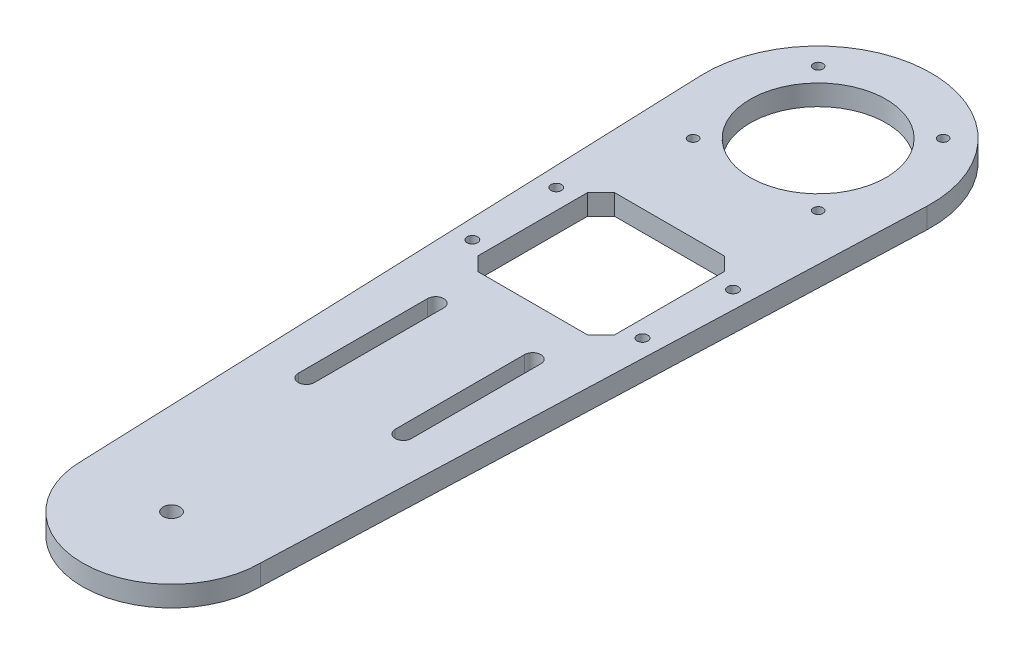
ISO-10303-21;
HEADER;
FILE_DESCRIPTION(('STEP AP214'),'2;1');
FILE_NAME('part.step','',(''),(''),'','','');
FILE_SCHEMA(('AUTOMOTIVE_DESIGN { 1 0 10303 214 1 1 1 1 }'));
ENDSEC;
DATA;
#1=APPLICATION_CONTEXT('core data for automotive mechanical design processes');
#2=APPLICATION_PROTOCOL_DEFINITION('international standard','automotive_design',2000,#1);
#3=PRODUCT_CONTEXT('',#1,'mechanical');
#4=PRODUCT('Part','Part','',(#3));
#5=PRODUCT_RELATED_PRODUCT_CATEGORY('part','',(#4));
#6=PRODUCT_DEFINITION_FORMATION('','',#4);
#7=PRODUCT_DEFINITION_CONTEXT('part definition',#1,'design');
#8=PRODUCT_DEFINITION('design','',#6,#7);
#9=PRODUCT_DEFINITION_SHAPE('','',#8);
#10=(LENGTH_UNIT() NAMED_UNIT(*) SI_UNIT(.MILLI.,.METRE.));
#11=(NAMED_UNIT(*) PLANE_ANGLE_UNIT() SI_UNIT($,.RADIAN.));
#12=(NAMED_UNIT(*) SI_UNIT($,.STERADIAN.) SOLID_ANGLE_UNIT());
#13=UNCERTAINTY_MEASURE_WITH_UNIT(LENGTH_MEASURE(1.E-05),#10,'distance_accuracy_value','');
#14=(GEOMETRIC_REPRESENTATION_CONTEXT(3) GLOBAL_UNCERTAINTY_ASSIGNED_CONTEXT((#13)) GLOBAL_UNIT_ASSIGNED_CONTEXT((#10,
#11,#12)) REPRESENTATION_CONTEXT('',''));
#15=CARTESIAN_POINT('',(0.,0.,0.));
#16=DIRECTION('',(0.,0.,1.));
#17=DIRECTION('',(1.,0.,0.));
#18=AXIS2_PLACEMENT_3D('',#15,#16,#17);
#19=CARTESIAN_POINT('',(0.,6.35,0.));
#20=DIRECTION('',(0.,1.,0.));
#21=DIRECTION('',(0.,0.,1.));
#22=AXIS2_PLACEMENT_3D('',#19,#20,#21);
#23=PLANE('',#22);
#24=CARTESIAN_POINT('',(-15.,6.35,-96.7));
#25=DIRECTION('',(0.,1.,0.));
#26=DIRECTION('',(0.,0.,1.));
#27=AXIS2_PLACEMENT_3D('',#24,#25,#26);
#28=CIRCLE('',#27,2.5);
#29=CARTESIAN_POINT('',(-12.5,6.35,-96.7));
#30=VERTEX_POINT('',#29);
#31=CARTESIAN_POINT('',(-17.5,6.35,-96.7));
#32=VERTEX_POINT('',#31);
#33=EDGE_CURVE('E207',#30,#32,#28,.T.);
#34=ORIENTED_EDGE('',*,*,#33,.F.);
#35=DIRECTION('',(0.,0.,-1.));
#36=VECTOR('',#35,1.);
#37=CARTESIAN_POINT('',(-12.5,6.35,-96.7));
#38=LINE('',#37,#36);
#39=CARTESIAN_POINT('',(-12.5,6.35,-56.7));
#40=VERTEX_POINT('',#39);
#41=EDGE_CURVE('E215',#40,#30,#38,.T.);
#42=ORIENTED_EDGE('',*,*,#41,.F.);
#43=CARTESIAN_POINT('',(-15.,6.35,-56.7));
#44=DIRECTION('',(0.,1.,0.));
#45=DIRECTION('',(0.,0.,1.));
#46=AXIS2_PLACEMENT_3D('',#43,#44,#45);
#47=CIRCLE('',#46,2.5);
#48=CARTESIAN_POINT('',(-17.5,6.35,-56.7));
#49=VERTEX_POINT('',#48);
#50=EDGE_CURVE('E229',#49,#40,#47,.T.);
#51=ORIENTED_EDGE('',*,*,#50,.F.);
#52=DIRECTION('',(0.,0.,1.));
#53=VECTOR('',#52,1.);
#54=CARTESIAN_POINT('',(-17.5,6.35,-96.7));
#55=LINE('',#54,#53);
#56=EDGE_CURVE('E226',#32,#49,#55,.T.);
#57=ORIENTED_EDGE('',*,*,#56,.F.);
#58=EDGE_LOOP('',(#34,#42,#51,#57));
#59=FACE_BOUND('',#58,.T.);
#60=CARTESIAN_POINT('',(27.331724457447,6.35,-146.340455158897));
#61=DIRECTION('',(0.,-1.,0.));
#62=DIRECTION('',(0.,0.,1.));
#63=AXIS2_PLACEMENT_3D('',#60,#61,#62);
#64=CIRCLE('',#63,1.625);
#65=CARTESIAN_POINT('',(27.331724457447,6.35,-144.715455158897));
#66=VERTEX_POINT('',#65);
#67=EDGE_CURVE('E247',#66,#66,#64,.T.);
#68=ORIENTED_EDGE('',*,*,#67,.T.);
#69=EDGE_LOOP('',(#68));
#70=FACE_BOUND('',#69,.T.);
#71=CARTESIAN_POINT('',(26.3165996261438,6.35,-119.359544841103));
#72=DIRECTION('',(0.,-1.,0.));
#73=DIRECTION('',(0.,0.,1.));
#74=AXIS2_PLACEMENT_3D('',#71,#72,#73);
#75=CIRCLE('',#74,1.625);
#76=CARTESIAN_POINT('',(26.3165996261438,6.35,-117.734544841103));
#77=VERTEX_POINT('',#76);
#78=EDGE_CURVE('E236',#77,#77,#75,.T.);
#79=ORIENTED_EDGE('',*,*,#78,.T.);
#80=EDGE_LOOP('',(#79));
#81=FACE_BOUND('',#80,.T.);
#82=CARTESIAN_POINT('',(-27.331724457447,6.35,-146.340455158897));
#83=DIRECTION('',(0.,1.,0.));
#84=DIRECTION('',(0.,0.,1.));
#85=AXIS2_PLACEMENT_3D('',#82,#83,#84);
#86=CIRCLE('',#85,1.625);
#87=CARTESIAN_POINT('',(-27.331724457447,6.35,-144.715455158897));
#88=VERTEX_POINT('',#87);
#89=EDGE_CURVE('E259',#88,#88,#86,.T.);
#90=ORIENTED_EDGE('',*,*,#89,.F.);
#91=EDGE_LOOP('',(#90));
#92=FACE_BOUND('',#91,.T.);
#93=CARTESIAN_POINT('',(-26.3165996261438,6.35,-119.359544841103));
#94=DIRECTION('',(0.,1.,0.));
#95=DIRECTION('',(0.,0.,1.));
#96=AXIS2_PLACEMENT_3D('',#93,#94,#95);
#97=CIRCLE('',#96,1.625);
#98=CARTESIAN_POINT('',(-26.3165996261438,6.35,-117.734544841103));
#99=VERTEX_POINT('',#98);
#100=EDGE_CURVE('E246',#99,#99,#97,.T.);
#101=ORIENTED_EDGE('',*,*,#100,.F.);
#102=EDGE_LOOP('',(#101));
#103=FACE_BOUND('',#102,.T.);
#104=DIRECTION('',(-0.707106781186544,0.,-0.70710678118655));
#105=VECTOR('',#104,1.);
#106=CARTESIAN_POINT('',(16.9780699909994,6.35,-154.));
#107=LINE('',#106,#105);
#108=CARTESIAN_POINT('',(21.15,6.35,-149.828069990999));
#109=VERTEX_POINT('',#108);
#110=CARTESIAN_POINT('',(16.9780699909994,6.35,-154.));
#111=VERTEX_POINT('',#110);
#112=EDGE_CURVE('E258',#109,#111,#107,.T.);
#113=ORIENTED_EDGE('',*,*,#112,.F.);
#114=DIRECTION('',(0.,0.,-1.));
#115=VECTOR('',#114,1.);
#116=CARTESIAN_POINT('',(21.15,6.35,-149.828069990999));
#117=LINE('',#116,#115);
#118=CARTESIAN_POINT('',(21.15,6.35,-115.871930009001));
#119=VERTEX_POINT('',#118);
#120=EDGE_CURVE('E271',#119,#109,#117,.T.);
#121=ORIENTED_EDGE('',*,*,#120,.F.);
#122=DIRECTION('',(0.707106781186546,0.,-0.707106781186549));
#123=VECTOR('',#122,1.);
#124=CARTESIAN_POINT('',(21.15,6.35,-115.871930009001));
#125=LINE('',#124,#123);
#126=CARTESIAN_POINT('',(16.9780699909994,6.35,-111.7));
#127=VERTEX_POINT('',#126);
#128=EDGE_CURVE('E309',#127,#119,#125,.T.);
#129=ORIENTED_EDGE('',*,*,#128,.F.);
#130=DIRECTION('',(1.,0.,0.));
#131=VECTOR('',#130,1.);
#132=CARTESIAN_POINT('',(16.9780699909994,6.35,-111.7));
#133=LINE('',#132,#131);
#134=CARTESIAN_POINT('',(-16.9780699909993,6.35,-111.7));
#135=VERTEX_POINT('',#134);
#136=EDGE_CURVE('E306',#135,#127,#133,.T.);
#137=ORIENTED_EDGE('',*,*,#136,.F.);
#138=DIRECTION('',(0.707106781186563,0.,0.707106781186532));
#139=VECTOR('',#138,1.);
#140=CARTESIAN_POINT('',(-16.9780699909993,6.35,-111.7));
#141=LINE('',#140,#139);
#142=CARTESIAN_POINT('',(-21.15,6.35,-115.871930009));
#143=VERTEX_POINT('',#142);
#144=EDGE_CURVE('E303',#143,#135,#141,.T.);
#145=ORIENTED_EDGE('',*,*,#144,.F.);
#146=DIRECTION('',(0.,0.,1.));
#147=VECTOR('',#146,1.);
#148=CARTESIAN_POINT('',(-21.15,6.35,-115.871930009));
#149=LINE('',#148,#147);
#150=CARTESIAN_POINT('',(-21.15,6.35,-149.828069990999));
#151=VERTEX_POINT('',#150);
#152=EDGE_CURVE('E300',#151,#143,#149,.T.);
#153=ORIENTED_EDGE('',*,*,#152,.F.);
#154=DIRECTION('',(-0.707106781186548,0.,0.707106781186547));
#155=VECTOR('',#154,1.);
#156=CARTESIAN_POINT('',(-21.15,6.35,-149.828069990999));
#157=LINE('',#156,#155);
#158=CARTESIAN_POINT('',(-16.9780699909993,6.35,-154.));
#159=VERTEX_POINT('',#158);
#160=EDGE_CURVE('E297',#159,#151,#157,.T.);
#161=ORIENTED_EDGE('',*,*,#160,.F.);
#162=DIRECTION('',(-1.,0.,0.));
#163=VECTOR('',#162,1.);
#164=CARTESIAN_POINT('',(-16.9780699909993,6.35,-154.));
#165=LINE('',#164,#163);
#166=EDGE_CURVE('E294',#111,#159,#165,.T.);
#167=ORIENTED_EDGE('',*,*,#166,.F.);
#168=EDGE_LOOP('',(#113,#121,#129,#137,#145,#153,#161,#167));
#169=FACE_BOUND('',#168,.T.);
#170=CARTESIAN_POINT('',(-19.3393704654521,6.35,-180.660629534548));
#171=DIRECTION('',(0.,1.,0.));
#172=DIRECTION('',(0.,0.,1.));
#173=AXIS2_PLACEMENT_3D('',#170,#171,#172);
#174=CIRCLE('',#173,1.5);
#175=CARTESIAN_POINT('',(-19.3393704654521,6.35,-179.160629534548));
#176=VERTEX_POINT('',#175);
#177=EDGE_CURVE('E316',#176,#176,#174,.T.);
#178=ORIENTED_EDGE('',*,*,#177,.F.);
#179=EDGE_LOOP('',(#178));
#180=FACE_BOUND('',#179,.T.);
#181=CARTESIAN_POINT('',(19.3393704654521,6.35,-180.660629534548));
#182=DIRECTION('',(0.,1.,0.));
#183=DIRECTION('',(0.,0.,1.));
#184=AXIS2_PLACEMENT_3D('',#181,#182,#183);
#185=CIRCLE('',#184,1.5);
#186=CARTESIAN_POINT('',(19.3393704654521,6.35,-179.160629534548));
#187=VERTEX_POINT('',#186);
#188=EDGE_CURVE('E341',#187,#187,#185,.T.);
#189=ORIENTED_EDGE('',*,*,#188,.F.);
#190=EDGE_LOOP('',(#189));
#191=FACE_BOUND('',#190,.T.);
#192=CARTESIAN_POINT('',(19.3393704654521,6.35,-219.339370465452));
#193=DIRECTION('',(0.,1.,0.));
#194=DIRECTION('',(0.,0.,1.));
#195=AXIS2_PLACEMENT_3D('',#192,#193,#194);
#196=CIRCLE('',#195,1.5);
#197=CARTESIAN_POINT('',(19.3393704654521,6.35,-217.839370465452));
#198=VERTEX_POINT('',#197);
#199=EDGE_CURVE('E335',#198,#198,#196,.T.);
#200=ORIENTED_EDGE('',*,*,#199,.F.);
#201=EDGE_LOOP('',(#200));
#202=FACE_BOUND('',#201,.T.);
#203=CARTESIAN_POINT('',(-19.3393704654521,6.35,-219.339370465452));
#204=DIRECTION('',(0.,1.,0.));
#205=DIRECTION('',(0.,0.,1.));
#206=AXIS2_PLACEMENT_3D('',#203,#204,#205);
#207=CIRCLE('',#206,1.5);
#208=CARTESIAN_POINT('',(-19.3393704654521,6.35,-217.839370465452));
#209=VERTEX_POINT('',#208);
#210=EDGE_CURVE('E334',#209,#209,#207,.T.);
#211=ORIENTED_EDGE('',*,*,#210,.F.);
#212=EDGE_LOOP('',(#211));
#213=FACE_BOUND('',#212,.T.);
#214=CARTESIAN_POINT('',(0.,6.35,-200.));
#215=DIRECTION('',(0.,1.,0.));
#216=DIRECTION('',(0.,0.,1.));
#217=AXIS2_PLACEMENT_3D('',#214,#215,#216);
#218=CIRCLE('',#217,21.);
#219=CARTESIAN_POINT('',(0.,6.35,-179.));
#220=VERTEX_POINT('',#219);
#221=EDGE_CURVE('E352',#220,#220,#218,.T.);
#222=ORIENTED_EDGE('',*,*,#221,.F.);
#223=EDGE_LOOP('',(#222));
#224=FACE_BOUND('',#223,.T.);
#225=CARTESIAN_POINT('',(0.,6.35,0.));
#226=DIRECTION('',(0.,1.,0.));
#227=DIRECTION('',(0.,0.,1.));
#228=AXIS2_PLACEMENT_3D('',#225,#226,#227);
#229=CIRCLE('',#228,2.6);
#230=CARTESIAN_POINT('',(0.,6.35,2.6));
#231=VERTEX_POINT('',#230);
#232=EDGE_CURVE('E358',#231,#231,#229,.T.);
#233=ORIENTED_EDGE('',*,*,#232,.F.);
#234=EDGE_LOOP('',(#233));
#235=FACE_BOUND('',#234,.T.);
#236=DIRECTION('',(0.0375972159741946,0.,-0.999292974733131));
#237=VECTOR('',#236,1.);
#238=CARTESIAN_POINT('',(27.4611273571522,6.35,1.03319242929476));
#239=LINE('',#238,#237);
#240=CARTESIAN_POINT('',(27.5,6.35,0.));
#241=VERTEX_POINT('',#240);
#242=CARTESIAN_POINT('',(34.9752541156596,6.35,-198.684097440903));
#243=VERTEX_POINT('',#242);
#244=EDGE_CURVE('E367',#241,#243,#239,.T.);
#245=ORIENTED_EDGE('',*,*,#244,.T.);
#246=CARTESIAN_POINT('',(0.,6.35,-200.));
#247=DIRECTION('',(0.,1.,0.));
#248=DIRECTION('',(0.,0.,1.));
#249=AXIS2_PLACEMENT_3D('',#246,#247,#248);
#250=CIRCLE('',#249,35.);
#251=CARTESIAN_POINT('',(-34.9752541156596,6.35,-198.684097440903));
#252=VERTEX_POINT('',#251);
#253=EDGE_CURVE('E370',#243,#252,#250,.T.);
#254=ORIENTED_EDGE('',*,*,#253,.T.);
#255=DIRECTION('',(-0.0375972159741946,0.,-0.999292974733131));
#256=VECTOR('',#255,1.);
#257=CARTESIAN_POINT('',(-27.4611273571522,6.35,1.03319242929476));
#258=LINE('',#257,#256);
#259=CARTESIAN_POINT('',(-27.5,6.35,0.));
#260=VERTEX_POINT('',#259);
#261=EDGE_CURVE('E373',#260,#252,#258,.T.);
#262=ORIENTED_EDGE('',*,*,#261,.F.);
#263=CARTESIAN_POINT('',(0.,6.35,0.));
#264=DIRECTION('',(0.,1.,0.));
#265=DIRECTION('',(0.,0.,1.));
#266=AXIS2_PLACEMENT_3D('',#263,#264,#265);
#267=CIRCLE('',#266,27.5);
#268=EDGE_CURVE('E376',#260,#241,#267,.T.);
#269=ORIENTED_EDGE('',*,*,#268,.T.);
#270=EDGE_LOOP('',(#245,#254,#262,#269));
#271=FACE_BOUND('',#270,.T.);
#272=DIRECTION('',(0.,0.,-1.));
#273=VECTOR('',#272,1.);
#274=CARTESIAN_POINT('',(12.5,6.35,-96.7));
#275=LINE('',#274,#273);
#276=CARTESIAN_POINT('',(12.5,6.35,-56.7));
#277=VERTEX_POINT('',#276);
#278=CARTESIAN_POINT('',(12.5,6.35,-96.7));
#279=VERTEX_POINT('',#278);
#280=EDGE_CURVE('E201',#277,#279,#275,.T.);
#281=ORIENTED_EDGE('',*,*,#280,.T.);
#282=CARTESIAN_POINT('',(15.,6.35,-96.7));
#283=DIRECTION('',(0.,-1.,0.));
#284=DIRECTION('',(0.,0.,1.));
#285=AXIS2_PLACEMENT_3D('',#282,#283,#284);
#286=CIRCLE('',#285,2.5);
#287=CARTESIAN_POINT('',(17.5,6.35,-96.7));
#288=VERTEX_POINT('',#287);
#289=EDGE_CURVE('E54',#279,#288,#286,.T.);
#290=ORIENTED_EDGE('',*,*,#289,.T.);
#291=DIRECTION('',(0.,0.,1.));
#292=VECTOR('',#291,1.);
#293=CARTESIAN_POINT('',(17.5,6.35,-96.7));
#294=LINE('',#293,#292);
#295=CARTESIAN_POINT('',(17.5,6.35,-56.7));
#296=VERTEX_POINT('',#295);
#297=EDGE_CURVE('E192',#288,#296,#294,.T.);
#298=ORIENTED_EDGE('',*,*,#297,.T.);
#299=CARTESIAN_POINT('',(15.,6.35,-56.7));
#300=DIRECTION('',(0.,-1.,0.));
#301=DIRECTION('',(0.,0.,1.));
#302=AXIS2_PLACEMENT_3D('',#299,#300,#301);
#303=CIRCLE('',#302,2.5);
#304=EDGE_CURVE('E195',#296,#277,#303,.T.);
#305=ORIENTED_EDGE('',*,*,#304,.T.);
#306=EDGE_LOOP('',(#281,#290,#298,#305));
#307=FACE_BOUND('',#306,.T.);
#308=ADVANCED_FACE('F39',(#59,#70,#81,#92,#103,#169,#180,#191,#202,#213,#224,#235,#271,#307),
#23,.T.);
#309=CARTESIAN_POINT('',(0.,0.,0.));
#310=DIRECTION('',(0.,1.,0.));
#311=DIRECTION('',(0.,0.,1.));
#312=AXIS2_PLACEMENT_3D('',#309,#310,#311);
#313=PLANE('',#312);
#314=DIRECTION('',(0.0375972159741946,0.,-0.999292974733131));
#315=VECTOR('',#314,1.);
#316=CARTESIAN_POINT('',(27.4611273571522,0.,1.03319242929476));
#317=LINE('',#316,#315);
#318=CARTESIAN_POINT('',(27.5,0.,0.));
#319=VERTEX_POINT('',#318);
#320=CARTESIAN_POINT('',(34.9752541156596,0.,-198.684097440903));
#321=VERTEX_POINT('',#320);
#322=EDGE_CURVE('E364',#319,#321,#317,.T.);
#323=ORIENTED_EDGE('',*,*,#322,.F.);
#324=CARTESIAN_POINT('',(0.,0.,0.));
#325=DIRECTION('',(0.,1.,0.));
#326=DIRECTION('',(0.,0.,1.));
#327=AXIS2_PLACEMENT_3D('',#324,#325,#326);
#328=CIRCLE('',#327,27.5);
#329=CARTESIAN_POINT('',(-27.5,0.,0.));
#330=VERTEX_POINT('',#329);
#331=EDGE_CURVE('E371',#330,#319,#328,.T.);
#332=ORIENTED_EDGE('',*,*,#331,.F.);
#333=DIRECTION('',(-0.0375972159741946,0.,-0.999292974733131));
#334=VECTOR('',#333,1.);
#335=CARTESIAN_POINT('',(-27.4611273571522,0.,1.03319242929476));
#336=LINE('',#335,#334);
#337=CARTESIAN_POINT('',(-34.9752541156596,0.,-198.684097440903));
#338=VERTEX_POINT('',#337);
#339=EDGE_CURVE('E384',#330,#338,#336,.T.);
#340=ORIENTED_EDGE('',*,*,#339,.T.);
#341=CARTESIAN_POINT('',(0.,0.,-200.));
#342=DIRECTION('',(0.,1.,0.));
#343=DIRECTION('',(0.,0.,1.));
#344=AXIS2_PLACEMENT_3D('',#341,#342,#343);
#345=CIRCLE('',#344,35.);
#346=EDGE_CURVE('E381',#321,#338,#345,.T.);
#347=ORIENTED_EDGE('',*,*,#346,.F.);
#348=EDGE_LOOP('',(#323,#332,#340,#347));
#349=FACE_BOUND('',#348,.T.);
#350=CARTESIAN_POINT('',(0.,0.,0.));
#351=DIRECTION('',(0.,1.,0.));
#352=DIRECTION('',(0.,0.,1.));
#353=AXIS2_PLACEMENT_3D('',#350,#351,#352);
#354=CIRCLE('',#353,2.6);
#355=CARTESIAN_POINT('',(0.,0.,2.6));
#356=VERTEX_POINT('',#355);
#357=EDGE_CURVE('E361',#356,#356,#354,.T.);
#358=ORIENTED_EDGE('',*,*,#357,.T.);
#359=EDGE_LOOP('',(#358));
#360=FACE_BOUND('',#359,.T.);
#361=CARTESIAN_POINT('',(0.,0.,-200.));
#362=DIRECTION('',(0.,1.,0.));
#363=DIRECTION('',(0.,0.,1.));
#364=AXIS2_PLACEMENT_3D('',#361,#362,#363);
#365=CIRCLE('',#364,21.);
#366=CARTESIAN_POINT('',(0.,0.,-179.));
#367=VERTEX_POINT('',#366);
#368=EDGE_CURVE('E355',#367,#367,#365,.T.);
#369=ORIENTED_EDGE('',*,*,#368,.T.);
#370=EDGE_LOOP('',(#369));
#371=FACE_BOUND('',#370,.T.);
#372=CARTESIAN_POINT('',(-19.3393704654521,0.,-219.339370465452));
#373=DIRECTION('',(0.,1.,0.));
#374=DIRECTION('',(0.,0.,1.));
#375=AXIS2_PLACEMENT_3D('',#372,#373,#374);
#376=CIRCLE('',#375,1.5);
#377=CARTESIAN_POINT('',(-19.3393704654521,0.,-217.839370465452));
#378=VERTEX_POINT('',#377);
#379=EDGE_CURVE('E349',#378,#378,#376,.T.);
#380=ORIENTED_EDGE('',*,*,#379,.T.);
#381=EDGE_LOOP('',(#380));
#382=FACE_BOUND('',#381,.T.);
#383=CARTESIAN_POINT('',(19.3393704654521,0.,-219.339370465452));
#384=DIRECTION('',(0.,1.,0.));
#385=DIRECTION('',(0.,0.,1.));
#386=AXIS2_PLACEMENT_3D('',#383,#384,#385);
#387=CIRCLE('',#386,1.5);
#388=CARTESIAN_POINT('',(19.3393704654521,0.,-217.839370465452));
#389=VERTEX_POINT('',#388);
#390=EDGE_CURVE('E331',#389,#389,#387,.T.);
#391=ORIENTED_EDGE('',*,*,#390,.T.);
#392=EDGE_LOOP('',(#391));
#393=FACE_BOUND('',#392,.T.);
#394=CARTESIAN_POINT('',(19.3393704654521,0.,-180.660629534548));
#395=DIRECTION('',(0.,1.,0.));
#396=DIRECTION('',(0.,0.,1.));
#397=AXIS2_PLACEMENT_3D('',#394,#395,#396);
#398=CIRCLE('',#397,1.5);
#399=CARTESIAN_POINT('',(19.3393704654521,0.,-179.160629534548));
#400=VERTEX_POINT('',#399);
#401=EDGE_CURVE('E338',#400,#400,#398,.T.);
#402=ORIENTED_EDGE('',*,*,#401,.T.);
#403=EDGE_LOOP('',(#402));
#404=FACE_BOUND('',#403,.T.);
#405=CARTESIAN_POINT('',(-19.3393704654521,0.,-180.660629534548));
#406=DIRECTION('',(0.,1.,0.));
#407=DIRECTION('',(0.,0.,1.));
#408=AXIS2_PLACEMENT_3D('',#405,#406,#407);
#409=CIRCLE('',#408,1.5);
#410=CARTESIAN_POINT('',(-19.3393704654521,0.,-179.160629534548));
#411=VERTEX_POINT('',#410);
#412=EDGE_CURVE('E344',#411,#411,#409,.T.);
#413=ORIENTED_EDGE('',*,*,#412,.T.);
#414=EDGE_LOOP('',(#413));
#415=FACE_BOUND('',#414,.T.);
#416=DIRECTION('',(0.,0.,-1.));
#417=VECTOR('',#416,1.);
#418=CARTESIAN_POINT('',(21.15,0.,-149.828069990999));
#419=LINE('',#418,#417);
#420=CARTESIAN_POINT('',(21.15,0.,-115.871930009001));
#421=VERTEX_POINT('',#420);
#422=CARTESIAN_POINT('',(21.15,0.,-149.828069990999));
#423=VERTEX_POINT('',#422);
#424=EDGE_CURVE('E289',#421,#423,#419,.T.);
#425=ORIENTED_EDGE('',*,*,#424,.T.);
#426=DIRECTION('',(-0.707106781186544,0.,-0.70710678118655));
#427=VECTOR('',#426,1.);
#428=CARTESIAN_POINT('',(16.9780699909994,0.,-154.));
#429=LINE('',#428,#427);
#430=CARTESIAN_POINT('',(16.9780699909994,0.,-154.));
#431=VERTEX_POINT('',#430);
#432=EDGE_CURVE('E267',#423,#431,#429,.T.);
#433=ORIENTED_EDGE('',*,*,#432,.T.);
#434=DIRECTION('',(-1.,0.,0.));
#435=VECTOR('',#434,1.);
#436=CARTESIAN_POINT('',(-16.9780699909993,0.,-154.));
#437=LINE('',#436,#435);
#438=CARTESIAN_POINT('',(-16.9780699909993,0.,-154.));
#439=VERTEX_POINT('',#438);
#440=EDGE_CURVE('E270',#431,#439,#437,.T.);
#441=ORIENTED_EDGE('',*,*,#440,.T.);
#442=DIRECTION('',(-0.707106781186548,0.,0.707106781186547));
#443=VECTOR('',#442,1.);
#444=CARTESIAN_POINT('',(-21.15,0.,-149.828069990999));
#445=LINE('',#444,#443);
#446=CARTESIAN_POINT('',(-21.15,0.,-149.828069990999));
#447=VERTEX_POINT('',#446);
#448=EDGE_CURVE('E274',#439,#447,#445,.T.);
#449=ORIENTED_EDGE('',*,*,#448,.T.);
#450=DIRECTION('',(0.,0.,1.));
#451=VECTOR('',#450,1.);
#452=CARTESIAN_POINT('',(-21.15,0.,-115.871930009));
#453=LINE('',#452,#451);
#454=CARTESIAN_POINT('',(-21.15,0.,-115.871930009));
#455=VERTEX_POINT('',#454);
#456=EDGE_CURVE('E277',#447,#455,#453,.T.);
#457=ORIENTED_EDGE('',*,*,#456,.T.);
#458=DIRECTION('',(0.707106781186563,0.,0.707106781186532));
#459=VECTOR('',#458,1.);
#460=CARTESIAN_POINT('',(-16.9780699909993,0.,-111.7));
#461=LINE('',#460,#459);
#462=CARTESIAN_POINT('',(-16.9780699909993,0.,-111.7));
#463=VERTEX_POINT('',#462);
#464=EDGE_CURVE('E280',#455,#463,#461,.T.);
#465=ORIENTED_EDGE('',*,*,#464,.T.);
#466=DIRECTION('',(1.,0.,0.));
#467=VECTOR('',#466,1.);
#468=CARTESIAN_POINT('',(16.9780699909994,0.,-111.7));
#469=LINE('',#468,#467);
#470=CARTESIAN_POINT('',(16.9780699909994,0.,-111.7));
#471=VERTEX_POINT('',#470);
#472=EDGE_CURVE('E283',#463,#471,#469,.T.);
#473=ORIENTED_EDGE('',*,*,#472,.T.);
#474=DIRECTION('',(0.707106781186546,0.,-0.707106781186549));
#475=VECTOR('',#474,1.);
#476=CARTESIAN_POINT('',(21.15,0.,-115.871930009001));
#477=LINE('',#476,#475);
#478=EDGE_CURVE('E286',#471,#421,#477,.T.);
#479=ORIENTED_EDGE('',*,*,#478,.T.);
#480=EDGE_LOOP('',(#425,#433,#441,#449,#457,#465,#473,#479));
#481=FACE_BOUND('',#480,.T.);
#482=CARTESIAN_POINT('',(-26.3165996261438,0.,-119.359544841103));
#483=DIRECTION('',(0.,1.,0.));
#484=DIRECTION('',(0.,0.,1.));
#485=AXIS2_PLACEMENT_3D('',#482,#483,#484);
#486=CIRCLE('',#485,1.625);
#487=CARTESIAN_POINT('',(-26.3165996261438,0.,-117.734544841103));
#488=VERTEX_POINT('',#487);
#489=EDGE_CURVE('E262',#488,#488,#486,.T.);
#490=ORIENTED_EDGE('',*,*,#489,.T.);
#491=EDGE_LOOP('',(#490));
#492=FACE_BOUND('',#491,.T.);
#493=CARTESIAN_POINT('',(-27.331724457447,0.,-146.340455158897));
#494=DIRECTION('',(0.,1.,0.));
#495=DIRECTION('',(0.,0.,1.));
#496=AXIS2_PLACEMENT_3D('',#493,#494,#495);
#497=CIRCLE('',#496,1.625);
#498=CARTESIAN_POINT('',(-27.331724457447,0.,-144.715455158897));
#499=VERTEX_POINT('',#498);
#500=EDGE_CURVE('E255',#499,#499,#497,.T.);
#501=ORIENTED_EDGE('',*,*,#500,.T.);
#502=EDGE_LOOP('',(#501));
#503=FACE_BOUND('',#502,.T.);
#504=CARTESIAN_POINT('',(26.3165996261438,0.,-119.359544841103));
#505=DIRECTION('',(0.,-1.,0.));
#506=DIRECTION('',(0.,0.,1.));
#507=AXIS2_PLACEMENT_3D('',#504,#505,#506);
#508=CIRCLE('',#507,1.625);
#509=CARTESIAN_POINT('',(26.3165996261438,0.,-117.734544841103));
#510=VERTEX_POINT('',#509);
#511=EDGE_CURVE('E250',#510,#510,#508,.T.);
#512=ORIENTED_EDGE('',*,*,#511,.F.);
#513=EDGE_LOOP('',(#512));
#514=FACE_BOUND('',#513,.T.);
#515=CARTESIAN_POINT('',(27.331724457447,0.,-146.340455158897));
#516=DIRECTION('',(0.,-1.,0.));
#517=DIRECTION('',(0.,0.,1.));
#518=AXIS2_PLACEMENT_3D('',#515,#516,#517);
#519=CIRCLE('',#518,1.625);
#520=CARTESIAN_POINT('',(27.331724457447,0.,-144.715455158897));
#521=VERTEX_POINT('',#520);
#522=EDGE_CURVE('E243',#521,#521,#519,.T.);
#523=ORIENTED_EDGE('',*,*,#522,.F.);
#524=EDGE_LOOP('',(#523));
#525=FACE_BOUND('',#524,.T.);
#526=DIRECTION('',(0.,0.,-1.));
#527=VECTOR('',#526,1.);
#528=CARTESIAN_POINT('',(-12.5,0.,-96.7));
#529=LINE('',#528,#527);
#530=CARTESIAN_POINT('',(-12.5,0.,-56.7));
#531=VERTEX_POINT('',#530);
#532=CARTESIAN_POINT('',(-12.5,0.,-96.7));
#533=VERTEX_POINT('',#532);
#534=EDGE_CURVE('E221',#531,#533,#529,.T.);
#535=ORIENTED_EDGE('',*,*,#534,.T.);
#536=CARTESIAN_POINT('',(-15.,0.,-96.7));
#537=DIRECTION('',(0.,1.,0.));
#538=DIRECTION('',(0.,0.,1.));
#539=AXIS2_PLACEMENT_3D('',#536,#537,#538);
#540=CIRCLE('',#539,2.5);
#541=CARTESIAN_POINT('',(-17.5,0.,-96.7));
#542=VERTEX_POINT('',#541);
#543=EDGE_CURVE('E211',#533,#542,#540,.T.);
#544=ORIENTED_EDGE('',*,*,#543,.T.);
#545=DIRECTION('',(0.,0.,1.));
#546=VECTOR('',#545,1.);
#547=CARTESIAN_POINT('',(-17.5,0.,-96.7));
#548=LINE('',#547,#546);
#549=CARTESIAN_POINT('',(-17.5,0.,-56.7));
#550=VERTEX_POINT('',#549);
#551=EDGE_CURVE('E214',#542,#550,#548,.T.);
#552=ORIENTED_EDGE('',*,*,#551,.T.);
#553=CARTESIAN_POINT('',(-15.,0.,-56.7));
#554=DIRECTION('',(0.,1.,0.));
#555=DIRECTION('',(0.,0.,1.));
#556=AXIS2_PLACEMENT_3D('',#553,#554,#555);
#557=CIRCLE('',#556,2.5);
#558=EDGE_CURVE('E218',#550,#531,#557,.T.);
#559=ORIENTED_EDGE('',*,*,#558,.T.);
#560=EDGE_LOOP('',(#535,#544,#552,#559));
#561=FACE_BOUND('',#560,.T.);
#562=CARTESIAN_POINT('',(15.,0.,-96.7));
#563=DIRECTION('',(0.,-1.,0.));
#564=DIRECTION('',(0.,0.,1.));
#565=AXIS2_PLACEMENT_3D('',#562,#563,#564);
#566=CIRCLE('',#565,2.5);
#567=CARTESIAN_POINT('',(12.5,0.,-96.7));
#568=VERTEX_POINT('',#567);
#569=CARTESIAN_POINT('',(17.5,0.,-96.7));
#570=VERTEX_POINT('',#569);
#571=EDGE_CURVE('E184',#568,#570,#566,.T.);
#572=ORIENTED_EDGE('',*,*,#571,.F.);
#573=DIRECTION('',(0.,0.,-1.));
#574=VECTOR('',#573,1.);
#575=CARTESIAN_POINT('',(12.5,0.,-96.7));
#576=LINE('',#575,#574);
#577=CARTESIAN_POINT('',(12.5,0.,-56.7));
#578=VERTEX_POINT('',#577);
#579=EDGE_CURVE('E176',#578,#568,#576,.T.);
#580=ORIENTED_EDGE('',*,*,#579,.F.);
#581=CARTESIAN_POINT('',(15.,0.,-56.7));
#582=DIRECTION('',(0.,-1.,0.));
#583=DIRECTION('',(0.,0.,1.));
#584=AXIS2_PLACEMENT_3D('',#581,#582,#583);
#585=CIRCLE('',#584,2.5);
#586=CARTESIAN_POINT('',(17.5,0.,-56.7));
#587=VERTEX_POINT('',#586);
#588=EDGE_CURVE('E183',#587,#578,#585,.T.);
#589=ORIENTED_EDGE('',*,*,#588,.F.);
#590=DIRECTION('',(0.,0.,1.));
#591=VECTOR('',#590,1.);
#592=CARTESIAN_POINT('',(17.5,0.,-96.7));
#593=LINE('',#592,#591);
#594=EDGE_CURVE('E188',#570,#587,#593,.T.);
#595=ORIENTED_EDGE('',*,*,#594,.F.);
#596=EDGE_LOOP('',(#572,#580,#589,#595));
#597=FACE_BOUND('',#596,.T.);
#598=ADVANCED_FACE('F191',(#349,#360,#371,#382,#393,#404,#415,#481,#492,#503,#514,#525,#561,
#597),#313,.F.);
#599=CARTESIAN_POINT('',(27.4611273571522,6.35,1.03319242929476));
#600=DIRECTION('',(-0.999292974733131,0.,-0.0375972159741946));
#601=DIRECTION('',(-0.0375972159741946,0.,0.999292974733131));
#602=AXIS2_PLACEMENT_3D('',#599,#600,#601);
#603=PLANE('',#602);
#604=ORIENTED_EDGE('',*,*,#322,.T.);
#605=DIRECTION('',(0.,-1.,0.));
#606=VECTOR('',#605,1.);
#607=CARTESIAN_POINT('',(34.9752541156596,6.35,-198.684097440903));
#608=LINE('',#607,#606);
#609=EDGE_CURVE('E11',#243,#321,#608,.T.);
#610=ORIENTED_EDGE('',*,*,#609,.F.);
#611=ORIENTED_EDGE('',*,*,#244,.F.);
#612=DIRECTION('',(0.,-1.,0.));
#613=VECTOR('',#612,1.);
#614=CARTESIAN_POINT('',(27.5,6.35,0.));
#615=LINE('',#614,#613);
#616=EDGE_CURVE('E378',#241,#319,#615,.T.);
#617=ORIENTED_EDGE('',*,*,#616,.T.);
#618=EDGE_LOOP('',(#604,#610,#611,#617));
#619=FACE_BOUND('',#618,.T.);
#620=ADVANCED_FACE('F41',(#619),#603,.F.);
#621=CARTESIAN_POINT('',(0.,6.35,-200.));
#622=DIRECTION('',(0.,-1.,0.));
#623=DIRECTION('',(0.,0.,-1.));
#624=AXIS2_PLACEMENT_3D('',#621,#622,#623);
#625=CYLINDRICAL_SURFACE('',#624,35.);
#626=ORIENTED_EDGE('',*,*,#346,.T.);
#627=DIRECTION('',(0.,-1.,0.));
#628=VECTOR('',#627,1.);
#629=CARTESIAN_POINT('',(-34.9752541156596,6.35,-198.684097440903));
#630=LINE('',#629,#628);
#631=EDGE_CURVE('E47',#252,#338,#630,.T.);
#632=ORIENTED_EDGE('',*,*,#631,.F.);
#633=ORIENTED_EDGE('',*,*,#253,.F.);
#634=ORIENTED_EDGE('',*,*,#609,.T.);
#635=EDGE_LOOP('',(#626,#632,#633,#634));
#636=FACE_BOUND('',#635,.T.);
#637=ADVANCED_FACE('F397',(#636),#625,.T.);
#638=CARTESIAN_POINT('',(-27.4611273571522,6.35,1.03319242929476));
#639=DIRECTION('',(-0.999292974733131,0.,0.0375972159741946));
#640=DIRECTION('',(0.0375972159741946,0.,0.999292974733131));
#641=AXIS2_PLACEMENT_3D('',#638,#639,#640);
#642=PLANE('',#641);
#643=ORIENTED_EDGE('',*,*,#339,.F.);
#644=DIRECTION('',(0.,-1.,0.));
#645=VECTOR('',#644,1.);
#646=CARTESIAN_POINT('',(-27.5,6.35,0.));
#647=LINE('',#646,#645);
#648=EDGE_CURVE('E390',#260,#330,#647,.T.);
#649=ORIENTED_EDGE('',*,*,#648,.F.);
#650=ORIENTED_EDGE('',*,*,#261,.T.);
#651=ORIENTED_EDGE('',*,*,#631,.T.);
#652=EDGE_LOOP('',(#643,#649,#650,#651));
#653=FACE_BOUND('',#652,.T.);
#654=ADVANCED_FACE('F394',(#653),#642,.T.);
#655=CARTESIAN_POINT('',(0.,6.35,0.));
#656=DIRECTION('',(0.,-1.,0.));
#657=DIRECTION('',(0.,0.,-1.));
#658=AXIS2_PLACEMENT_3D('',#655,#656,#657);
#659=CYLINDRICAL_SURFACE('',#658,27.5);
#660=ORIENTED_EDGE('',*,*,#331,.T.);
#661=ORIENTED_EDGE('',*,*,#616,.F.);
#662=ORIENTED_EDGE('',*,*,#268,.F.);
#663=ORIENTED_EDGE('',*,*,#648,.T.);
#664=EDGE_LOOP('',(#660,#661,#662,#663));
#665=FACE_BOUND('',#664,.T.);
#666=ADVANCED_FACE('F405',(#665),#659,.T.);
#667=CARTESIAN_POINT('',(0.,0.,0.));
#668=DIRECTION('',(0.,1.,0.));
#669=DIRECTION('',(0.,0.,1.));
#670=AXIS2_PLACEMENT_3D('',#667,#668,#669);
#671=CYLINDRICAL_SURFACE('',#670,2.6);
#672=ORIENTED_EDGE('',*,*,#357,.F.);
#673=EDGE_LOOP('',(#672));
#674=FACE_BOUND('',#673,.T.);
#675=ORIENTED_EDGE('',*,*,#232,.T.);
#676=EDGE_LOOP('',(#675));
#677=FACE_BOUND('',#676,.T.);
#678=ADVANCED_FACE('F514',(#674,#677),#671,.F.);
#679=CARTESIAN_POINT('',(0.,0.,-200.));
#680=DIRECTION('',(0.,1.,0.));
#681=DIRECTION('',(0.,0.,1.));
#682=AXIS2_PLACEMENT_3D('',#679,#680,#681);
#683=CYLINDRICAL_SURFACE('',#682,21.);
#684=ORIENTED_EDGE('',*,*,#368,.F.);
#685=EDGE_LOOP('',(#684));
#686=FACE_BOUND('',#685,.T.);
#687=ORIENTED_EDGE('',*,*,#221,.T.);
#688=EDGE_LOOP('',(#687));
#689=FACE_BOUND('',#688,.T.);
#690=ADVANCED_FACE('F510',(#686,#689),#683,.F.);
#691=CARTESIAN_POINT('',(-19.3393704654521,0.,-219.339370465452));
#692=DIRECTION('',(0.,1.,0.));
#693=DIRECTION('',(0.,0.,1.));
#694=AXIS2_PLACEMENT_3D('',#691,#692,#693);
#695=CYLINDRICAL_SURFACE('',#694,1.5);
#696=ORIENTED_EDGE('',*,*,#379,.F.);
#697=EDGE_LOOP('',(#696));
#698=FACE_BOUND('',#697,.T.);
#699=ORIENTED_EDGE('',*,*,#210,.T.);
#700=EDGE_LOOP('',(#699));
#701=FACE_BOUND('',#700,.T.);
#702=ADVANCED_FACE('F500',(#698,#701),#695,.F.);
#703=CARTESIAN_POINT('',(19.3393704654521,0.,-219.339370465452));
#704=DIRECTION('',(0.,1.,0.));
#705=DIRECTION('',(0.,0.,1.));
#706=AXIS2_PLACEMENT_3D('',#703,#704,#705);
#707=CYLINDRICAL_SURFACE('',#706,1.5);
#708=ORIENTED_EDGE('',*,*,#390,.F.);
#709=EDGE_LOOP('',(#708));
#710=FACE_BOUND('',#709,.T.);
#711=ORIENTED_EDGE('',*,*,#199,.T.);
#712=EDGE_LOOP('',(#711));
#713=FACE_BOUND('',#712,.T.);
#714=ADVANCED_FACE('F496',(#710,#713),#707,.F.);
#715=CARTESIAN_POINT('',(19.3393704654521,0.,-180.660629534548));
#716=DIRECTION('',(0.,1.,0.));
#717=DIRECTION('',(0.,0.,1.));
#718=AXIS2_PLACEMENT_3D('',#715,#716,#717);
#719=CYLINDRICAL_SURFACE('',#718,1.5);
#720=ORIENTED_EDGE('',*,*,#401,.F.);
#721=EDGE_LOOP('',(#720));
#722=FACE_BOUND('',#721,.T.);
#723=ORIENTED_EDGE('',*,*,#188,.T.);
#724=EDGE_LOOP('',(#723));
#725=FACE_BOUND('',#724,.T.);
#726=ADVANCED_FACE('F499',(#722,#725),#719,.F.);
#727=CARTESIAN_POINT('',(-19.3393704654521,0.,-180.660629534548));
#728=DIRECTION('',(0.,1.,0.));
#729=DIRECTION('',(0.,0.,1.));
#730=AXIS2_PLACEMENT_3D('',#727,#728,#729);
#731=CYLINDRICAL_SURFACE('',#730,1.5);
#732=ORIENTED_EDGE('',*,*,#412,.F.);
#733=EDGE_LOOP('',(#732));
#734=FACE_BOUND('',#733,.T.);
#735=ORIENTED_EDGE('',*,*,#177,.T.);
#736=EDGE_LOOP('',(#735));
#737=FACE_BOUND('',#736,.T.);
#738=ADVANCED_FACE('F494',(#734,#737),#731,.F.);
#739=CARTESIAN_POINT('',(16.9780699909994,0.,-154.));
#740=DIRECTION('',(0.707106781186551,0.,-0.707106781186545));
#741=DIRECTION('',(-0.707106781186545,0.,-0.70710678118655));
#742=AXIS2_PLACEMENT_3D('',#739,#740,#741);
#743=PLANE('',#742);
#744=ORIENTED_EDGE('',*,*,#112,.T.);
#745=DIRECTION('',(0.,1.,0.));
#746=VECTOR('',#745,1.);
#747=CARTESIAN_POINT('',(16.9780699909994,0.,-154.));
#748=LINE('',#747,#746);
#749=EDGE_CURVE('E292',#431,#111,#748,.T.);
#750=ORIENTED_EDGE('',*,*,#749,.F.);
#751=ORIENTED_EDGE('',*,*,#432,.F.);
#752=DIRECTION('',(0.,1.,0.));
#753=VECTOR('',#752,1.);
#754=CARTESIAN_POINT('',(21.15,0.,-149.828069990999));
#755=LINE('',#754,#753);
#756=EDGE_CURVE('E314',#423,#109,#755,.T.);
#757=ORIENTED_EDGE('',*,*,#756,.T.);
#758=EDGE_LOOP('',(#744,#750,#751,#757));
#759=FACE_BOUND('',#758,.T.);
#760=ADVANCED_FACE('F468',(#759),#743,.F.);
#761=CARTESIAN_POINT('',(21.15,0.,-149.828069990999));
#762=DIRECTION('',(1.,0.,0.));
#763=DIRECTION('',(0.,0.,-1.));
#764=AXIS2_PLACEMENT_3D('',#761,#762,#763);
#765=PLANE('',#764);
#766=ORIENTED_EDGE('',*,*,#120,.T.);
#767=ORIENTED_EDGE('',*,*,#756,.F.);
#768=ORIENTED_EDGE('',*,*,#424,.F.);
#769=DIRECTION('',(0.,1.,0.));
#770=VECTOR('',#769,1.);
#771=CARTESIAN_POINT('',(21.15,0.,-115.871930009001));
#772=LINE('',#771,#770);
#773=EDGE_CURVE('E317',#421,#119,#772,.T.);
#774=ORIENTED_EDGE('',*,*,#773,.T.);
#775=EDGE_LOOP('',(#766,#767,#768,#774));
#776=FACE_BOUND('',#775,.T.);
#777=ADVANCED_FACE('F464',(#776),#765,.F.);
#778=CARTESIAN_POINT('',(21.15,0.,-115.871930009001));
#779=DIRECTION('',(0.707106781186549,0.,0.707106781186546));
#780=DIRECTION('',(0.707106781186546,0.,-0.707106781186549));
#781=AXIS2_PLACEMENT_3D('',#778,#779,#780);
#782=PLANE('',#781);
#783=ORIENTED_EDGE('',*,*,#128,.T.);
#784=ORIENTED_EDGE('',*,*,#773,.F.);
#785=ORIENTED_EDGE('',*,*,#478,.F.);
#786=DIRECTION('',(0.,1.,0.));
#787=VECTOR('',#786,1.);
#788=CARTESIAN_POINT('',(16.9780699909994,0.,-111.7));
#789=LINE('',#788,#787);
#790=EDGE_CURVE('E319',#471,#127,#789,.T.);
#791=ORIENTED_EDGE('',*,*,#790,.T.);
#792=EDGE_LOOP('',(#783,#784,#785,#791));
#793=FACE_BOUND('',#792,.T.);
#794=ADVANCED_FACE('F467',(#793),#782,.F.);
#795=CARTESIAN_POINT('',(16.9780699909994,0.,-111.7));
#796=DIRECTION('',(0.,0.,1.));
#797=DIRECTION('',(1.,0.,0.));
#798=AXIS2_PLACEMENT_3D('',#795,#796,#797);
#799=PLANE('',#798);
#800=ORIENTED_EDGE('',*,*,#136,.T.);
#801=ORIENTED_EDGE('',*,*,#790,.F.);
#802=ORIENTED_EDGE('',*,*,#472,.F.);
#803=DIRECTION('',(0.,1.,0.));
#804=VECTOR('',#803,1.);
#805=CARTESIAN_POINT('',(-16.9780699909993,0.,-111.7));
#806=LINE('',#805,#804);
#807=EDGE_CURVE('E321',#463,#135,#806,.T.);
#808=ORIENTED_EDGE('',*,*,#807,.T.);
#809=EDGE_LOOP('',(#800,#801,#802,#808));
#810=FACE_BOUND('',#809,.T.);
#811=ADVANCED_FACE('F472',(#810),#799,.F.);
#812=CARTESIAN_POINT('',(-16.9780699909993,0.,-111.7));
#813=DIRECTION('',(-0.707106781186532,0.,0.707106781186563));
#814=DIRECTION('',(0.707106781186563,0.,0.707106781186532));
#815=AXIS2_PLACEMENT_3D('',#812,#813,#814);
#816=PLANE('',#815);
#817=ORIENTED_EDGE('',*,*,#144,.T.);
#818=ORIENTED_EDGE('',*,*,#807,.F.);
#819=ORIENTED_EDGE('',*,*,#464,.F.);
#820=DIRECTION('',(0.,1.,0.));
#821=VECTOR('',#820,1.);
#822=CARTESIAN_POINT('',(-21.15,0.,-115.871930009));
#823=LINE('',#822,#821);
#824=EDGE_CURVE('E323',#455,#143,#823,.T.);
#825=ORIENTED_EDGE('',*,*,#824,.T.);
#826=EDGE_LOOP('',(#817,#818,#819,#825));
#827=FACE_BOUND('',#826,.T.);
#828=ADVANCED_FACE('F476',(#827),#816,.F.);
#829=CARTESIAN_POINT('',(-21.15,0.,-115.871930009));
#830=DIRECTION('',(-1.,0.,0.));
#831=DIRECTION('',(0.,0.,1.));
#832=AXIS2_PLACEMENT_3D('',#829,#830,#831);
#833=PLANE('',#832);
#834=ORIENTED_EDGE('',*,*,#152,.T.);
#835=ORIENTED_EDGE('',*,*,#824,.F.);
#836=ORIENTED_EDGE('',*,*,#456,.F.);
#837=DIRECTION('',(0.,1.,0.));
#838=VECTOR('',#837,1.);
#839=CARTESIAN_POINT('',(-21.15,0.,-149.828069990999));
#840=LINE('',#839,#838);
#841=EDGE_CURVE('E325',#447,#151,#840,.T.);
#842=ORIENTED_EDGE('',*,*,#841,.T.);
#843=EDGE_LOOP('',(#834,#835,#836,#842));
#844=FACE_BOUND('',#843,.T.);
#845=ADVANCED_FACE('F480',(#844),#833,.F.);
#846=CARTESIAN_POINT('',(-21.15,0.,-149.828069990999));
#847=DIRECTION('',(-0.707106781186547,0.,-0.707106781186548));
#848=DIRECTION('',(-0.707106781186548,0.,0.707106781186547));
#849=AXIS2_PLACEMENT_3D('',#846,#847,#848);
#850=PLANE('',#849);
#851=ORIENTED_EDGE('',*,*,#160,.T.);
#852=ORIENTED_EDGE('',*,*,#841,.F.);
#853=ORIENTED_EDGE('',*,*,#448,.F.);
#854=DIRECTION('',(0.,1.,0.));
#855=VECTOR('',#854,1.);
#856=CARTESIAN_POINT('',(-16.9780699909993,0.,-154.));
#857=LINE('',#856,#855);
#858=EDGE_CURVE('E327',#439,#159,#857,.T.);
#859=ORIENTED_EDGE('',*,*,#858,.T.);
#860=EDGE_LOOP('',(#851,#852,#853,#859));
#861=FACE_BOUND('',#860,.T.);
#862=ADVANCED_FACE('F484',(#861),#850,.F.);
#863=CARTESIAN_POINT('',(-16.9780699909993,0.,-154.));
#864=DIRECTION('',(0.,0.,-1.));
#865=DIRECTION('',(-1.,0.,0.));
#866=AXIS2_PLACEMENT_3D('',#863,#864,#865);
#867=PLANE('',#866);
#868=ORIENTED_EDGE('',*,*,#166,.T.);
#869=ORIENTED_EDGE('',*,*,#858,.F.);
#870=ORIENTED_EDGE('',*,*,#440,.F.);
#871=ORIENTED_EDGE('',*,*,#749,.T.);
#872=EDGE_LOOP('',(#868,#869,#870,#871));
#873=FACE_BOUND('',#872,.T.);
#874=ADVANCED_FACE('F462',(#873),#867,.F.);
#875=CARTESIAN_POINT('',(-26.3165996261438,0.,-119.359544841103));
#876=DIRECTION('',(0.,1.,0.));
#877=DIRECTION('',(0.,0.,1.));
#878=AXIS2_PLACEMENT_3D('',#875,#876,#877);
#879=CYLINDRICAL_SURFACE('',#878,1.625);
#880=ORIENTED_EDGE('',*,*,#489,.F.);
#881=EDGE_LOOP('',(#880));
#882=FACE_BOUND('',#881,.T.);
#883=ORIENTED_EDGE('',*,*,#100,.T.);
#884=EDGE_LOOP('',(#883));
#885=FACE_BOUND('',#884,.T.);
#886=ADVANCED_FACE('F458',(#882,#885),#879,.F.);
#887=CARTESIAN_POINT('',(-27.331724457447,0.,-146.340455158897));
#888=DIRECTION('',(0.,1.,0.));
#889=DIRECTION('',(0.,0.,1.));
#890=AXIS2_PLACEMENT_3D('',#887,#888,#889);
#891=CYLINDRICAL_SURFACE('',#890,1.625);
#892=ORIENTED_EDGE('',*,*,#500,.F.);
#893=EDGE_LOOP('',(#892));
#894=FACE_BOUND('',#893,.T.);
#895=ORIENTED_EDGE('',*,*,#89,.T.);
#896=EDGE_LOOP('',(#895));
#897=FACE_BOUND('',#896,.T.);
#898=ADVANCED_FACE('F454',(#894,#897),#891,.F.);
#899=CARTESIAN_POINT('',(26.3165996261438,0.,-119.359544841103));
#900=DIRECTION('',(0.,1.,0.));
#901=DIRECTION('',(0.,0.,1.));
#902=AXIS2_PLACEMENT_3D('',#899,#900,#901);
#903=CYLINDRICAL_SURFACE('',#902,1.625);
#904=ORIENTED_EDGE('',*,*,#511,.T.);
#905=EDGE_LOOP('',(#904));
#906=FACE_BOUND('',#905,.T.);
#907=ORIENTED_EDGE('',*,*,#78,.F.);
#908=EDGE_LOOP('',(#907));
#909=FACE_BOUND('',#908,.T.);
#910=ADVANCED_FACE('F450',(#906,#909),#903,.F.);
#911=CARTESIAN_POINT('',(27.331724457447,0.,-146.340455158897));
#912=DIRECTION('',(0.,1.,0.));
#913=DIRECTION('',(0.,0.,1.));
#914=AXIS2_PLACEMENT_3D('',#911,#912,#913);
#915=CYLINDRICAL_SURFACE('',#914,1.625);
#916=ORIENTED_EDGE('',*,*,#522,.T.);
#917=EDGE_LOOP('',(#916));
#918=FACE_BOUND('',#917,.T.);
#919=ORIENTED_EDGE('',*,*,#67,.F.);
#920=EDGE_LOOP('',(#919));
#921=FACE_BOUND('',#920,.T.);
#922=ADVANCED_FACE('F446',(#918,#921),#915,.F.);
#923=CARTESIAN_POINT('',(-15.,0.,-96.7));
#924=DIRECTION('',(0.,1.,0.));
#925=DIRECTION('',(0.,0.,1.));
#926=AXIS2_PLACEMENT_3D('',#923,#924,#925);
#927=CYLINDRICAL_SURFACE('',#926,2.5);
#928=ORIENTED_EDGE('',*,*,#33,.T.);
#929=DIRECTION('',(0.,1.,0.));
#930=VECTOR('',#929,1.);
#931=CARTESIAN_POINT('',(-17.5,0.,-96.7));
#932=LINE('',#931,#930);
#933=EDGE_CURVE('E224',#542,#32,#932,.T.);
#934=ORIENTED_EDGE('',*,*,#933,.F.);
#935=ORIENTED_EDGE('',*,*,#543,.F.);
#936=DIRECTION('',(0.,1.,0.));
#937=VECTOR('',#936,1.);
#938=CARTESIAN_POINT('',(-12.5,0.,-96.7));
#939=LINE('',#938,#937);
#940=EDGE_CURVE('E234',#533,#30,#939,.T.);
#941=ORIENTED_EDGE('',*,*,#940,.T.);
#942=EDGE_LOOP('',(#928,#934,#935,#941));
#943=FACE_BOUND('',#942,.T.);
#944=ADVANCED_FACE('F436',(#943),#927,.F.);
#945=CARTESIAN_POINT('',(-12.5,0.,-96.7));
#946=DIRECTION('',(1.,0.,0.));
#947=DIRECTION('',(0.,0.,-1.));
#948=AXIS2_PLACEMENT_3D('',#945,#946,#947);
#949=PLANE('',#948);
#950=ORIENTED_EDGE('',*,*,#41,.T.);
#951=ORIENTED_EDGE('',*,*,#940,.F.);
#952=ORIENTED_EDGE('',*,*,#534,.F.);
#953=DIRECTION('',(0.,1.,0.));
#954=VECTOR('',#953,1.);
#955=CARTESIAN_POINT('',(-12.5,0.,-56.7));
#956=LINE('',#955,#954);
#957=EDGE_CURVE('E237',#531,#40,#956,.T.);
#958=ORIENTED_EDGE('',*,*,#957,.T.);
#959=EDGE_LOOP('',(#950,#951,#952,#958));
#960=FACE_BOUND('',#959,.T.);
#961=ADVANCED_FACE('F432',(#960),#949,.F.);
#962=CARTESIAN_POINT('',(-15.,0.,-56.7));
#963=DIRECTION('',(0.,1.,0.));
#964=DIRECTION('',(0.,0.,1.));
#965=AXIS2_PLACEMENT_3D('',#962,#963,#964);
#966=CYLINDRICAL_SURFACE('',#965,2.5);
#967=ORIENTED_EDGE('',*,*,#50,.T.);
#968=ORIENTED_EDGE('',*,*,#957,.F.);
#969=ORIENTED_EDGE('',*,*,#558,.F.);
#970=DIRECTION('',(0.,1.,0.));
#971=VECTOR('',#970,1.);
#972=CARTESIAN_POINT('',(-17.5,0.,-56.7));
#973=LINE('',#972,#971);
#974=EDGE_CURVE('E239',#550,#49,#973,.T.);
#975=ORIENTED_EDGE('',*,*,#974,.T.);
#976=EDGE_LOOP('',(#967,#968,#969,#975));
#977=FACE_BOUND('',#976,.T.);
#978=ADVANCED_FACE('F435',(#977),#966,.F.);
#979=CARTESIAN_POINT('',(-17.5,0.,-96.7));
#980=DIRECTION('',(-1.,0.,0.));
#981=DIRECTION('',(0.,0.,1.));
#982=AXIS2_PLACEMENT_3D('',#979,#980,#981);
#983=PLANE('',#982);
#984=ORIENTED_EDGE('',*,*,#56,.T.);
#985=ORIENTED_EDGE('',*,*,#974,.F.);
#986=ORIENTED_EDGE('',*,*,#551,.F.);
#987=ORIENTED_EDGE('',*,*,#933,.T.);
#988=EDGE_LOOP('',(#984,#985,#986,#987));
#989=FACE_BOUND('',#988,.T.);
#990=ADVANCED_FACE('F427',(#989),#983,.F.);
#991=CARTESIAN_POINT('',(15.,0.,-96.7));
#992=DIRECTION('',(0.,1.,0.));
#993=DIRECTION('',(0.,0.,1.));
#994=AXIS2_PLACEMENT_3D('',#991,#992,#993);
#995=CYLINDRICAL_SURFACE('',#994,2.5);
#996=ORIENTED_EDGE('',*,*,#289,.F.);
#997=DIRECTION('',(0.,1.,0.));
#998=VECTOR('',#997,1.);
#999=CARTESIAN_POINT('',(12.5,0.,-96.7));
#1000=LINE('',#999,#998);
#1001=EDGE_CURVE('E178',#568,#279,#1000,.T.);
#1002=ORIENTED_EDGE('',*,*,#1001,.F.);
#1003=ORIENTED_EDGE('',*,*,#571,.T.);
#1004=DIRECTION('',(0.,1.,0.));
#1005=VECTOR('',#1004,1.);
#1006=CARTESIAN_POINT('',(17.5,0.,-96.7));
#1007=LINE('',#1006,#1005);
#1008=EDGE_CURVE('E205',#570,#288,#1007,.T.);
#1009=ORIENTED_EDGE('',*,*,#1008,.T.);
#1010=EDGE_LOOP('',(#996,#1002,#1003,#1009));
#1011=FACE_BOUND('',#1010,.T.);
#1012=ADVANCED_FACE('F186',(#1011),#995,.F.);
#1013=CARTESIAN_POINT('',(17.5,0.,-96.7));
#1014=DIRECTION('',(-1.,0.,0.));
#1015=DIRECTION('',(0.,0.,1.));
#1016=AXIS2_PLACEMENT_3D('',#1013,#1014,#1015);
#1017=PLANE('',#1016);
#1018=ORIENTED_EDGE('',*,*,#297,.F.);
#1019=ORIENTED_EDGE('',*,*,#1008,.F.);
#1020=ORIENTED_EDGE('',*,*,#594,.T.);
#1021=DIRECTION('',(0.,1.,0.));
#1022=VECTOR('',#1021,1.);
#1023=CARTESIAN_POINT('',(17.5,0.,-56.7));
#1024=LINE('',#1023,#1022);
#1025=EDGE_CURVE('E208',#587,#296,#1024,.T.);
#1026=ORIENTED_EDGE('',*,*,#1025,.T.);
#1027=EDGE_LOOP('',(#1018,#1019,#1020,#1026));
#1028=FACE_BOUND('',#1027,.T.);
#1029=ADVANCED_FACE('F419',(#1028),#1017,.T.);
#1030=CARTESIAN_POINT('',(15.,0.,-56.7));
#1031=DIRECTION('',(0.,1.,0.));
#1032=DIRECTION('',(0.,0.,1.));
#1033=AXIS2_PLACEMENT_3D('',#1030,#1031,#1032);
#1034=CYLINDRICAL_SURFACE('',#1033,2.5);
#1035=ORIENTED_EDGE('',*,*,#304,.F.);
#1036=ORIENTED_EDGE('',*,*,#1025,.F.);
#1037=ORIENTED_EDGE('',*,*,#588,.T.);
#1038=DIRECTION('',(0.,1.,0.));
#1039=VECTOR('',#1038,1.);
#1040=CARTESIAN_POINT('',(12.5,0.,-56.7));
#1041=LINE('',#1040,#1039);
#1042=EDGE_CURVE('E62',#578,#277,#1041,.T.);
#1043=ORIENTED_EDGE('',*,*,#1042,.T.);
#1044=EDGE_LOOP('',(#1035,#1036,#1037,#1043));
#1045=FACE_BOUND('',#1044,.T.);
#1046=ADVANCED_FACE('F417',(#1045),#1034,.F.);
#1047=CARTESIAN_POINT('',(12.5,0.,-96.7));
#1048=DIRECTION('',(1.,0.,0.));
#1049=DIRECTION('',(0.,0.,-1.));
#1050=AXIS2_PLACEMENT_3D('',#1047,#1048,#1049);
#1051=PLANE('',#1050);
#1052=ORIENTED_EDGE('',*,*,#280,.F.);
#1053=ORIENTED_EDGE('',*,*,#1042,.F.);
#1054=ORIENTED_EDGE('',*,*,#579,.T.);
#1055=ORIENTED_EDGE('',*,*,#1001,.T.);
#1056=EDGE_LOOP('',(#1052,#1053,#1054,#1055));
#1057=FACE_BOUND('',#1056,.T.);
#1058=ADVANCED_FACE('F177',(#1057),#1051,.T.);
#1059=CLOSED_SHELL('',(#308,#598,#620,#637,#654,#666,#678,#690,#702,#714,#726,#738,#760,#777,
#794,#811,#828,#845,#862,#874,#886,#898,#910,#922,#944,#961,#978,#990,#1012,#1029,#1046,#1058));
#1060=MANIFOLD_SOLID_BREP('B2',#1059);
#1061=ADVANCED_BREP_SHAPE_REPRESENTATION('',(#18,#1060),#14);
#1062=SHAPE_DEFINITION_REPRESENTATION(#9,#1061);
ENDSEC;
END-ISO-10303-21;
